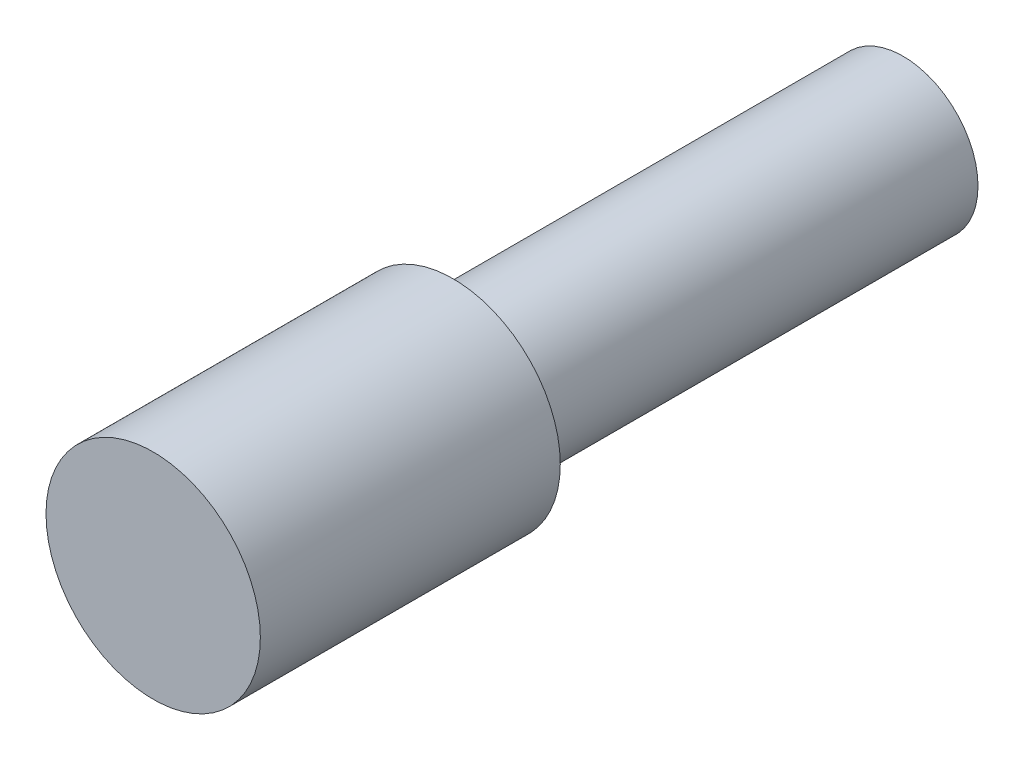
ISO-10303-21;
HEADER;
FILE_DESCRIPTION(('STEP AP214'),'2;1');
FILE_NAME('part.step','',(''),(''),'','','');
FILE_SCHEMA(('AUTOMOTIVE_DESIGN { 1 0 10303 214 1 1 1 1 }'));
ENDSEC;
DATA;
#1=APPLICATION_CONTEXT('core data for automotive mechanical design processes');
#2=APPLICATION_PROTOCOL_DEFINITION('international standard','automotive_design',2000,#1);
#3=PRODUCT_CONTEXT('',#1,'mechanical');
#4=PRODUCT('Part','Part','',(#3));
#5=PRODUCT_RELATED_PRODUCT_CATEGORY('part','',(#4));
#6=PRODUCT_DEFINITION_FORMATION('','',#4);
#7=PRODUCT_DEFINITION_CONTEXT('part definition',#1,'design');
#8=PRODUCT_DEFINITION('design','',#6,#7);
#9=PRODUCT_DEFINITION_SHAPE('','',#8);
#10=(LENGTH_UNIT() NAMED_UNIT(*) SI_UNIT(.MILLI.,.METRE.));
#11=(NAMED_UNIT(*) PLANE_ANGLE_UNIT() SI_UNIT($,.RADIAN.));
#12=(NAMED_UNIT(*) SI_UNIT($,.STERADIAN.) SOLID_ANGLE_UNIT());
#13=UNCERTAINTY_MEASURE_WITH_UNIT(LENGTH_MEASURE(1.E-05),#10,'distance_accuracy_value','');
#14=(GEOMETRIC_REPRESENTATION_CONTEXT(3) GLOBAL_UNCERTAINTY_ASSIGNED_CONTEXT((#13)) GLOBAL_UNIT_ASSIGNED_CONTEXT((#10,
#11,#12)) REPRESENTATION_CONTEXT('',''));
#15=CARTESIAN_POINT('',(0.,0.,0.));
#16=DIRECTION('',(0.,0.,1.));
#17=DIRECTION('',(1.,0.,0.));
#18=AXIS2_PLACEMENT_3D('',#15,#16,#17);
#19=CARTESIAN_POINT('',(0.,0.,30.));
#20=DIRECTION('',(0.,0.,1.));
#21=DIRECTION('',(1.,0.,0.));
#22=AXIS2_PLACEMENT_3D('',#19,#20,#21);
#23=CYLINDRICAL_SURFACE('',#22,7.14678071539025);
#24=CARTESIAN_POINT('',(0.,0.,30.));
#25=DIRECTION('',(0.,0.,1.));
#26=DIRECTION('',(1.,0.,0.));
#27=AXIS2_PLACEMENT_3D('',#24,#25,#26);
#28=CIRCLE('',#27,7.14678071539025);
#29=CARTESIAN_POINT('',(7.14678071539025,0.,30.));
#30=VERTEX_POINT('',#29);
#31=EDGE_CURVE('E50',#30,#30,#28,.T.);
#32=ORIENTED_EDGE('',*,*,#31,.T.);
#33=EDGE_LOOP('',(#32));
#34=FACE_BOUND('',#33,.T.);
#35=CARTESIAN_POINT('',(0.,0.,50.));
#36=DIRECTION('',(0.,0.,1.));
#37=DIRECTION('',(1.,0.,0.));
#38=AXIS2_PLACEMENT_3D('',#35,#36,#37);
#39=CIRCLE('',#38,7.14678071539025);
#40=CARTESIAN_POINT('',(7.14678071539025,0.,50.));
#41=VERTEX_POINT('',#40);
#42=EDGE_CURVE('E55',#41,#41,#39,.T.);
#43=ORIENTED_EDGE('',*,*,#42,.F.);
#44=EDGE_LOOP('',(#43));
#45=FACE_BOUND('',#44,.T.);
#46=ADVANCED_FACE('F37',(#34,#45),#23,.T.);
#47=CARTESIAN_POINT('',(0.,0.,30.));
#48=DIRECTION('',(0.,0.,1.));
#49=DIRECTION('',(1.,0.,0.));
#50=AXIS2_PLACEMENT_3D('',#47,#48,#49);
#51=PLANE('',#50);
#52=CARTESIAN_POINT('',(0.,0.,30.));
#53=DIRECTION('',(0.,0.,1.));
#54=DIRECTION('',(1.,0.,0.));
#55=AXIS2_PLACEMENT_3D('',#52,#53,#54);
#56=CIRCLE('',#55,5.);
#57=CARTESIAN_POINT('',(5.,0.,30.));
#58=VERTEX_POINT('',#57);
#59=EDGE_CURVE('E10',#58,#58,#56,.T.);
#60=ORIENTED_EDGE('',*,*,#59,.T.);
#61=EDGE_LOOP('',(#60));
#62=FACE_BOUND('',#61,.T.);
#63=ORIENTED_EDGE('',*,*,#31,.F.);
#64=EDGE_LOOP('',(#63));
#65=FACE_BOUND('',#64,.T.);
#66=ADVANCED_FACE('F65',(#62,#65),#51,.F.);
#67=CARTESIAN_POINT('',(0.,0.,50.));
#68=DIRECTION('',(0.,0.,1.));
#69=DIRECTION('',(1.,0.,0.));
#70=AXIS2_PLACEMENT_3D('',#67,#68,#69);
#71=PLANE('',#70);
#72=ORIENTED_EDGE('',*,*,#42,.T.);
#73=EDGE_LOOP('',(#72));
#74=FACE_BOUND('',#73,.T.);
#75=ADVANCED_FACE('F62',(#74),#71,.T.);
#76=CARTESIAN_POINT('',(0.,0.,50.));
#77=DIRECTION('',(0.,0.,-1.));
#78=DIRECTION('',(-1.,0.,0.));
#79=AXIS2_PLACEMENT_3D('',#76,#77,#78);
#80=CYLINDRICAL_SURFACE('',#79,5.);
#81=CARTESIAN_POINT('',(0.,0.,0.));
#82=DIRECTION('',(0.,0.,1.));
#83=DIRECTION('',(1.,0.,0.));
#84=AXIS2_PLACEMENT_3D('',#81,#82,#83);
#85=CIRCLE('',#84,5.);
#86=CARTESIAN_POINT('',(5.,0.,0.));
#87=VERTEX_POINT('',#86);
#88=EDGE_CURVE('E45',#87,#87,#85,.T.);
#89=ORIENTED_EDGE('',*,*,#88,.T.);
#90=EDGE_LOOP('',(#89));
#91=FACE_BOUND('',#90,.T.);
#92=ORIENTED_EDGE('',*,*,#59,.F.);
#93=EDGE_LOOP('',(#92));
#94=FACE_BOUND('',#93,.T.);
#95=ADVANCED_FACE('F39',(#91,#94),#80,.T.);
#96=CARTESIAN_POINT('',(0.,0.,0.));
#97=DIRECTION('',(0.,0.,1.));
#98=DIRECTION('',(1.,0.,0.));
#99=AXIS2_PLACEMENT_3D('',#96,#97,#98);
#100=PLANE('',#99);
#101=ORIENTED_EDGE('',*,*,#88,.F.);
#102=EDGE_LOOP('',(#101));
#103=FACE_BOUND('',#102,.T.);
#104=ADVANCED_FACE('F74',(#103),#100,.F.);
#105=CLOSED_SHELL('',(#46,#66,#75,#95,#104));
#106=MANIFOLD_SOLID_BREP('B2',#105);
#107=ADVANCED_BREP_SHAPE_REPRESENTATION('',(#18,#106),#14);
#108=SHAPE_DEFINITION_REPRESENTATION(#9,#107);
ENDSEC;
END-ISO-10303-21;
